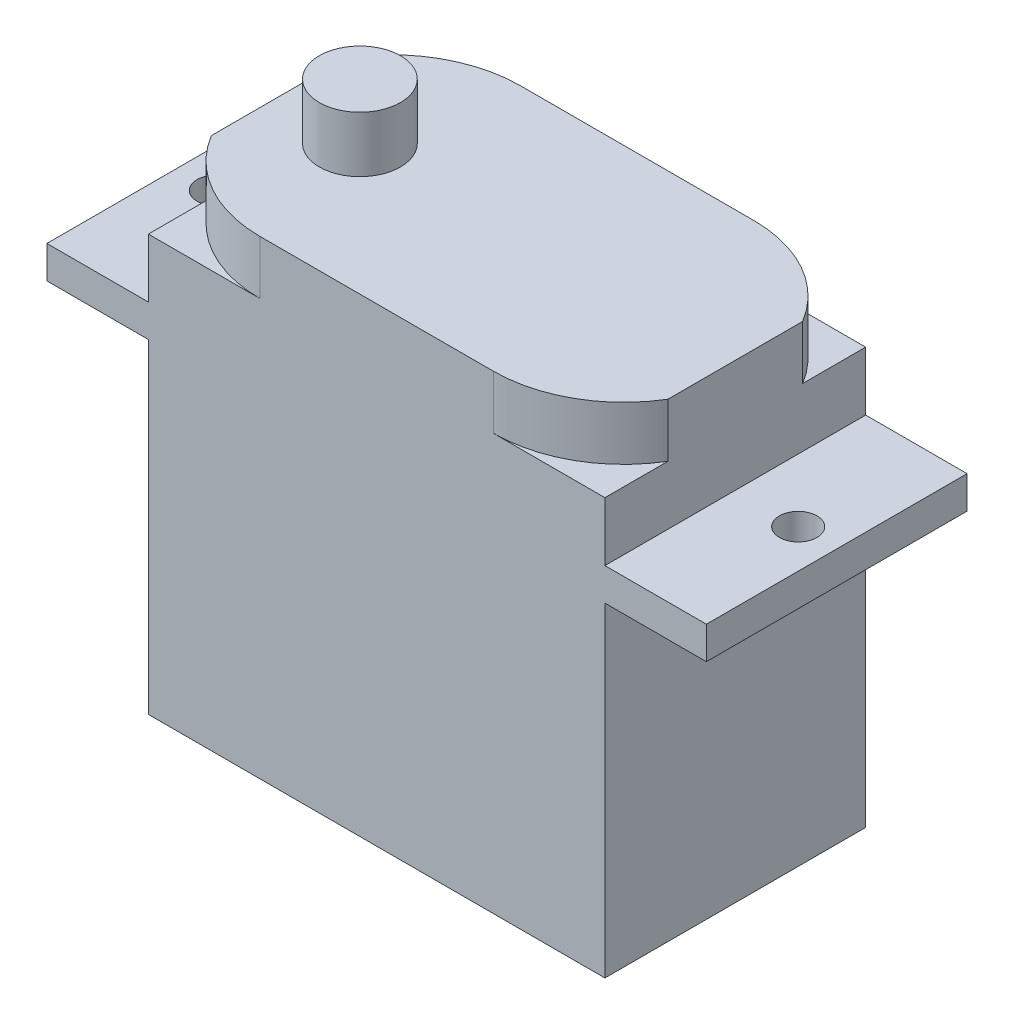
ISO-10303-21;
HEADER;
FILE_DESCRIPTION(('STEP AP214'),'2;1');
FILE_NAME('part.step','',(''),(''),'','','');
FILE_SCHEMA(('AUTOMOTIVE_DESIGN { 1 0 10303 214 1 1 1 1 }'));
ENDSEC;
DATA;
#1=APPLICATION_CONTEXT('core data for automotive mechanical design processes');
#2=APPLICATION_PROTOCOL_DEFINITION('international standard','automotive_design',2000,#1);
#3=PRODUCT_CONTEXT('',#1,'mechanical');
#4=PRODUCT('Part','Part','',(#3));
#5=PRODUCT_RELATED_PRODUCT_CATEGORY('part','',(#4));
#6=PRODUCT_DEFINITION_FORMATION('','',#4);
#7=PRODUCT_DEFINITION_CONTEXT('part definition',#1,'design');
#8=PRODUCT_DEFINITION('design','',#6,#7);
#9=PRODUCT_DEFINITION_SHAPE('','',#8);
#10=(LENGTH_UNIT() NAMED_UNIT(*) SI_UNIT(.MILLI.,.METRE.));
#11=(NAMED_UNIT(*) PLANE_ANGLE_UNIT() SI_UNIT($,.RADIAN.));
#12=(NAMED_UNIT(*) SI_UNIT($,.STERADIAN.) SOLID_ANGLE_UNIT());
#13=UNCERTAINTY_MEASURE_WITH_UNIT(LENGTH_MEASURE(1.E-05),#10,'distance_accuracy_value','');
#14=(GEOMETRIC_REPRESENTATION_CONTEXT(3) GLOBAL_UNCERTAINTY_ASSIGNED_CONTEXT((#13)) GLOBAL_UNIT_ASSIGNED_CONTEXT((#10,
#11,#12)) REPRESENTATION_CONTEXT('',''));
#15=CARTESIAN_POINT('',(0.,0.,0.));
#16=DIRECTION('',(0.,0.,1.));
#17=DIRECTION('',(1.,0.,0.));
#18=AXIS2_PLACEMENT_3D('',#15,#16,#17);
#19=CARTESIAN_POINT('',(-5.74999999999998,12.9,6.425));
#20=DIRECTION('',(0.,1.,0.));
#21=DIRECTION('',(0.,0.,1.));
#22=AXIS2_PLACEMENT_3D('',#19,#20,#21);
#23=PLANE('',#22);
#24=CARTESIAN_POINT('',(-5.74999999999998,12.9,6.425));
#25=DIRECTION('',(0.,1.,0.));
#26=DIRECTION('',(0.,0.,1.));
#27=AXIS2_PLACEMENT_3D('',#24,#25,#26);
#28=CIRCLE('',#27,6.425);
#29=CARTESIAN_POINT('',(-5.74999999999998,12.9,0.));
#30=VERTEX_POINT('',#29);
#31=CARTESIAN_POINT('',(-11.25,12.9,3.10376152617732));
#32=VERTEX_POINT('',#31);
#33=EDGE_CURVE('E321',#30,#32,#28,.T.);
#34=ORIENTED_EDGE('',*,*,#33,.T.);
#35=DIRECTION('',(0.,0.,1.));
#36=VECTOR('',#35,1.);
#37=CARTESIAN_POINT('',(-11.25,12.9,9.74623847382268));
#38=LINE('',#37,#36);
#39=CARTESIAN_POINT('',(-11.25,12.9,9.74623847382268));
#40=VERTEX_POINT('',#39);
#41=EDGE_CURVE('E651',#32,#40,#38,.T.);
#42=ORIENTED_EDGE('',*,*,#41,.T.);
#43=CARTESIAN_POINT('',(-5.74999999999998,12.9,6.425));
#44=DIRECTION('',(0.,1.,0.));
#45=DIRECTION('',(0.,0.,1.));
#46=AXIS2_PLACEMENT_3D('',#43,#44,#45);
#47=CIRCLE('',#46,6.425);
#48=CARTESIAN_POINT('',(-5.74999999999998,12.9,12.85));
#49=VERTEX_POINT('',#48);
#50=EDGE_CURVE('E653',#40,#49,#47,.T.);
#51=ORIENTED_EDGE('',*,*,#50,.T.);
#52=DIRECTION('',(1.,0.,0.));
#53=VECTOR('',#52,1.);
#54=CARTESIAN_POINT('',(-5.74999999999998,12.9,12.85));
#55=LINE('',#54,#53);
#56=CARTESIAN_POINT('',(5.75000000000004,12.9,12.85));
#57=VERTEX_POINT('',#56);
#58=EDGE_CURVE('E655',#49,#57,#55,.T.);
#59=ORIENTED_EDGE('',*,*,#58,.T.);
#60=CARTESIAN_POINT('',(5.75000000000004,12.9,6.425));
#61=DIRECTION('',(0.,1.,0.));
#62=DIRECTION('',(0.,0.,-1.));
#63=AXIS2_PLACEMENT_3D('',#60,#61,#62);
#64=CIRCLE('',#63,6.425);
#65=CARTESIAN_POINT('',(11.25,12.9,9.74623847382268));
#66=VERTEX_POINT('',#65);
#67=EDGE_CURVE('E657',#57,#66,#64,.T.);
#68=ORIENTED_EDGE('',*,*,#67,.T.);
#69=DIRECTION('',(0.,0.,-1.));
#70=VECTOR('',#69,1.);
#71=CARTESIAN_POINT('',(11.25,12.9,3.10376152617732));
#72=LINE('',#71,#70);
#73=CARTESIAN_POINT('',(11.25,12.9,3.10376152617732));
#74=VERTEX_POINT('',#73);
#75=EDGE_CURVE('E340',#66,#74,#72,.T.);
#76=ORIENTED_EDGE('',*,*,#75,.T.);
#77=CARTESIAN_POINT('',(5.75000000000004,12.9,6.425));
#78=DIRECTION('',(0.,1.,0.));
#79=DIRECTION('',(0.,0.,-1.));
#80=AXIS2_PLACEMENT_3D('',#77,#78,#79);
#81=CIRCLE('',#80,6.425);
#82=CARTESIAN_POINT('',(5.75000000000004,12.9,0.));
#83=VERTEX_POINT('',#82);
#84=EDGE_CURVE('E335',#74,#83,#81,.T.);
#85=ORIENTED_EDGE('',*,*,#84,.T.);
#86=DIRECTION('',(-1.,0.,0.));
#87=VECTOR('',#86,1.);
#88=CARTESIAN_POINT('',(-5.74999999999998,12.9,0.));
#89=LINE('',#88,#87);
#90=EDGE_CURVE('E661',#83,#30,#89,.T.);
#91=ORIENTED_EDGE('',*,*,#90,.T.);
#92=EDGE_LOOP('',(#34,#42,#51,#59,#68,#76,#85,#91));
#93=FACE_BOUND('',#92,.T.);
#94=CARTESIAN_POINT('',(-7.24999999999998,12.9,6.425));
#95=DIRECTION('',(0.,1.,0.));
#96=DIRECTION('',(0.,0.,1.));
#97=AXIS2_PLACEMENT_3D('',#94,#95,#96);
#98=CIRCLE('',#97,2.);
#99=CARTESIAN_POINT('',(-7.24999999999998,12.9,8.425));
#100=VERTEX_POINT('',#99);
#101=EDGE_CURVE('E722',#100,#100,#98,.T.);
#102=ORIENTED_EDGE('',*,*,#101,.F.);
#103=EDGE_LOOP('',(#102));
#104=FACE_BOUND('',#103,.T.);
#105=ADVANCED_FACE('F30',(#93,#104),#23,.T.);
#106=CARTESIAN_POINT('',(16.25,7.34999999999998,0.));
#107=DIRECTION('',(0.,1.,0.));
#108=DIRECTION('',(0.,0.,1.));
#109=AXIS2_PLACEMENT_3D('',#106,#107,#108);
#110=PLANE('',#109);
#111=DIRECTION('',(0.,0.,-1.));
#112=VECTOR('',#111,1.);
#113=CARTESIAN_POINT('',(11.25,7.34999999999998,0.));
#114=LINE('',#113,#112);
#115=CARTESIAN_POINT('',(11.25,7.34999999999998,12.85));
#116=VERTEX_POINT('',#115);
#117=CARTESIAN_POINT('',(11.25,7.34999999999998,0.));
#118=VERTEX_POINT('',#117);
#119=EDGE_CURVE('E204',#116,#118,#114,.T.);
#120=ORIENTED_EDGE('',*,*,#119,.F.);
#121=DIRECTION('',(-1.,0.,0.));
#122=VECTOR('',#121,1.);
#123=CARTESIAN_POINT('',(16.25,7.34999999999998,12.85));
#124=LINE('',#123,#122);
#125=CARTESIAN_POINT('',(16.25,7.34999999999998,12.85));
#126=VERTEX_POINT('',#125);
#127=EDGE_CURVE('E178',#126,#116,#124,.T.);
#128=ORIENTED_EDGE('',*,*,#127,.F.);
#129=DIRECTION('',(0.,0.,-1.));
#130=VECTOR('',#129,1.);
#131=CARTESIAN_POINT('',(16.25,7.34999999999998,0.));
#132=LINE('',#131,#130);
#133=CARTESIAN_POINT('',(16.25,7.34999999999998,0.));
#134=VERTEX_POINT('',#133);
#135=EDGE_CURVE('E184',#126,#134,#132,.T.);
#136=ORIENTED_EDGE('',*,*,#135,.T.);
#137=DIRECTION('',(-1.,0.,0.));
#138=VECTOR('',#137,1.);
#139=CARTESIAN_POINT('',(16.25,7.34999999999998,0.));
#140=LINE('',#139,#138);
#141=EDGE_CURVE('E47',#134,#118,#140,.T.);
#142=ORIENTED_EDGE('',*,*,#141,.T.);
#143=EDGE_LOOP('',(#120,#128,#136,#142));
#144=FACE_BOUND('',#143,.T.);
#145=CARTESIAN_POINT('',(14.35,7.34999999999998,6.425));
#146=DIRECTION('',(0.,-1.,0.));
#147=DIRECTION('',(0.,0.,1.));
#148=AXIS2_PLACEMENT_3D('',#145,#146,#147);
#149=CIRCLE('',#148,0.925000000000001);
#150=CARTESIAN_POINT('',(14.35,7.34999999999998,7.35));
#151=VERTEX_POINT('',#150);
#152=EDGE_CURVE('E721',#151,#151,#149,.T.);
#153=ORIENTED_EDGE('',*,*,#152,.T.);
#154=EDGE_LOOP('',(#153));
#155=FACE_BOUND('',#154,.T.);
#156=ADVANCED_FACE('F190',(#144,#155),#110,.T.);
#157=CARTESIAN_POINT('',(16.25,5.74999999999998,0.));
#158=DIRECTION('',(0.,-1.,0.));
#159=DIRECTION('',(0.,0.,-1.));
#160=AXIS2_PLACEMENT_3D('',#157,#158,#159);
#161=PLANE('',#160);
#162=DIRECTION('',(0.,0.,1.));
#163=VECTOR('',#162,1.);
#164=CARTESIAN_POINT('',(11.25,5.74999999999998,0.));
#165=LINE('',#164,#163);
#166=CARTESIAN_POINT('',(11.25,5.74999999999998,0.));
#167=VERTEX_POINT('',#166);
#168=CARTESIAN_POINT('',(11.25,5.74999999999998,12.85));
#169=VERTEX_POINT('',#168);
#170=EDGE_CURVE('E188',#167,#169,#165,.T.);
#171=ORIENTED_EDGE('',*,*,#170,.F.);
#172=DIRECTION('',(-1.,0.,0.));
#173=VECTOR('',#172,1.);
#174=CARTESIAN_POINT('',(16.25,5.74999999999998,0.));
#175=LINE('',#174,#173);
#176=CARTESIAN_POINT('',(16.25,5.74999999999998,0.));
#177=VERTEX_POINT('',#176);
#178=EDGE_CURVE('E198',#177,#167,#175,.T.);
#179=ORIENTED_EDGE('',*,*,#178,.F.);
#180=DIRECTION('',(0.,0.,1.));
#181=VECTOR('',#180,1.);
#182=CARTESIAN_POINT('',(16.25,5.74999999999998,0.));
#183=LINE('',#182,#181);
#184=CARTESIAN_POINT('',(16.25,5.74999999999998,12.85));
#185=VERTEX_POINT('',#184);
#186=EDGE_CURVE('E187',#177,#185,#183,.T.);
#187=ORIENTED_EDGE('',*,*,#186,.T.);
#188=DIRECTION('',(-1.,0.,0.));
#189=VECTOR('',#188,1.);
#190=CARTESIAN_POINT('',(16.25,5.74999999999998,12.85));
#191=LINE('',#190,#189);
#192=EDGE_CURVE('E213',#185,#169,#191,.T.);
#193=ORIENTED_EDGE('',*,*,#192,.T.);
#194=EDGE_LOOP('',(#171,#179,#187,#193));
#195=FACE_BOUND('',#194,.T.);
#196=CARTESIAN_POINT('',(14.35,5.74999999999998,6.425));
#197=DIRECTION('',(0.,-1.,0.));
#198=DIRECTION('',(0.,0.,-1.));
#199=AXIS2_PLACEMENT_3D('',#196,#197,#198);
#200=CIRCLE('',#199,0.925000000000001);
#201=CARTESIAN_POINT('',(14.35,5.74999999999998,5.5));
#202=VERTEX_POINT('',#201);
#203=EDGE_CURVE('E34',#202,#202,#200,.F.);
#204=ORIENTED_EDGE('',*,*,#203,.T.);
#205=EDGE_LOOP('',(#204));
#206=FACE_BOUND('',#205,.T.);
#207=ADVANCED_FACE('F227',(#195,#206),#161,.T.);
#208=CARTESIAN_POINT('',(11.25,-10.25,12.85));
#209=DIRECTION('',(-1.,0.,0.));
#210=DIRECTION('',(0.,0.,1.));
#211=AXIS2_PLACEMENT_3D('',#208,#209,#210);
#212=PLANE('',#211);
#213=DIRECTION('',(0.,1.,0.));
#214=VECTOR('',#213,1.);
#215=CARTESIAN_POINT('',(11.25,-10.25,0.));
#216=LINE('',#215,#214);
#217=CARTESIAN_POINT('',(11.25,-10.25,0.));
#218=VERTEX_POINT('',#217);
#219=EDGE_CURVE('E225',#218,#167,#216,.T.);
#220=ORIENTED_EDGE('',*,*,#219,.T.);
#221=ORIENTED_EDGE('',*,*,#170,.T.);
#222=DIRECTION('',(0.,1.,0.));
#223=VECTOR('',#222,1.);
#224=CARTESIAN_POINT('',(11.25,-10.25,12.85));
#225=LINE('',#224,#223);
#226=CARTESIAN_POINT('',(11.25,-10.25,12.85));
#227=VERTEX_POINT('',#226);
#228=EDGE_CURVE('E274',#227,#169,#225,.T.);
#229=ORIENTED_EDGE('',*,*,#228,.F.);
#230=DIRECTION('',(0.,0.,-1.));
#231=VECTOR('',#230,1.);
#232=CARTESIAN_POINT('',(11.25,-10.25,12.85));
#233=LINE('',#232,#231);
#234=EDGE_CURVE('E235',#227,#218,#233,.T.);
#235=ORIENTED_EDGE('',*,*,#234,.T.);
#236=EDGE_LOOP('',(#220,#221,#229,#235));
#237=FACE_BOUND('',#236,.T.);
#238=ADVANCED_FACE('F233',(#237),#212,.F.);
#239=CARTESIAN_POINT('',(-11.25,-10.25,12.85));
#240=DIRECTION('',(1.,0.,0.));
#241=DIRECTION('',(0.,0.,-1.));
#242=AXIS2_PLACEMENT_3D('',#239,#240,#241);
#243=PLANE('',#242);
#244=DIRECTION('',(0.,0.,-1.));
#245=VECTOR('',#244,1.);
#246=CARTESIAN_POINT('',(-11.25,7.34999999999998,0.));
#247=LINE('',#246,#245);
#248=CARTESIAN_POINT('',(-11.25,7.34999999999998,12.85));
#249=VERTEX_POINT('',#248);
#250=CARTESIAN_POINT('',(-11.25,7.34999999999998,0.));
#251=VERTEX_POINT('',#250);
#252=EDGE_CURVE('E55',#249,#251,#247,.T.);
#253=ORIENTED_EDGE('',*,*,#252,.F.);
#254=DIRECTION('',(0.,-1.,0.));
#255=VECTOR('',#254,1.);
#256=CARTESIAN_POINT('',(-11.25,-10.25,12.85));
#257=LINE('',#256,#255);
#258=CARTESIAN_POINT('',(-11.25,10.25,12.85));
#259=VERTEX_POINT('',#258);
#260=EDGE_CURVE('E286',#259,#249,#257,.T.);
#261=ORIENTED_EDGE('',*,*,#260,.F.);
#262=DIRECTION('',(0.,0.,-1.));
#263=VECTOR('',#262,1.);
#264=CARTESIAN_POINT('',(-11.25,10.25,12.85));
#265=LINE('',#264,#263);
#266=CARTESIAN_POINT('',(-11.25,10.25,9.74623847382268));
#267=VERTEX_POINT('',#266);
#268=EDGE_CURVE('E343',#259,#267,#265,.T.);
#269=ORIENTED_EDGE('',*,*,#268,.T.);
#270=DIRECTION('',(0.,-1.,0.));
#271=VECTOR('',#270,1.);
#272=CARTESIAN_POINT('',(-11.25,12.9,9.74623847382268));
#273=LINE('',#272,#271);
#274=EDGE_CURVE('E674',#40,#267,#273,.T.);
#275=ORIENTED_EDGE('',*,*,#274,.F.);
#276=ORIENTED_EDGE('',*,*,#41,.F.);
#277=DIRECTION('',(0.,-1.,0.));
#278=VECTOR('',#277,1.);
#279=CARTESIAN_POINT('',(-11.25,12.9,3.10376152617732));
#280=LINE('',#279,#278);
#281=CARTESIAN_POINT('',(-11.25,10.25,3.10376152617732));
#282=VERTEX_POINT('',#281);
#283=EDGE_CURVE('E241',#32,#282,#280,.T.);
#284=ORIENTED_EDGE('',*,*,#283,.T.);
#285=CARTESIAN_POINT('',(-11.25,10.25,0.));
#286=VERTEX_POINT('',#285);
#287=EDGE_CURVE('E345',#282,#286,#265,.T.);
#288=ORIENTED_EDGE('',*,*,#287,.T.);
#289=DIRECTION('',(0.,-1.,0.));
#290=VECTOR('',#289,1.);
#291=CARTESIAN_POINT('',(-11.25,-10.25,0.));
#292=LINE('',#291,#290);
#293=EDGE_CURVE('E289',#286,#251,#292,.T.);
#294=ORIENTED_EDGE('',*,*,#293,.T.);
#295=EDGE_LOOP('',(#253,#261,#269,#275,#276,#284,#288,#294));
#296=FACE_BOUND('',#295,.T.);
#297=ADVANCED_FACE('F529',(#296),#243,.F.);
#298=DIRECTION('',(0.,0.,1.));
#299=VECTOR('',#298,1.);
#300=CARTESIAN_POINT('',(-11.25,5.74999999999998,0.));
#301=LINE('',#300,#299);
#302=CARTESIAN_POINT('',(-11.25,5.74999999999998,0.));
#303=VERTEX_POINT('',#302);
#304=CARTESIAN_POINT('',(-11.25,5.74999999999998,12.85));
#305=VERTEX_POINT('',#304);
#306=EDGE_CURVE('E617',#303,#305,#301,.T.);
#307=ORIENTED_EDGE('',*,*,#306,.F.);
#308=CARTESIAN_POINT('',(-11.25,-10.25,0.));
#309=VERTEX_POINT('',#308);
#310=EDGE_CURVE('E261',#303,#309,#292,.T.);
#311=ORIENTED_EDGE('',*,*,#310,.T.);
#312=DIRECTION('',(0.,0.,-1.));
#313=VECTOR('',#312,1.);
#314=CARTESIAN_POINT('',(-11.25,-10.25,12.85));
#315=LINE('',#314,#313);
#316=CARTESIAN_POINT('',(-11.25,-10.25,12.85));
#317=VERTEX_POINT('',#316);
#318=EDGE_CURVE('E349',#317,#309,#315,.T.);
#319=ORIENTED_EDGE('',*,*,#318,.F.);
#320=EDGE_CURVE('E283',#305,#317,#257,.T.);
#321=ORIENTED_EDGE('',*,*,#320,.F.);
#322=EDGE_LOOP('',(#307,#311,#319,#321));
#323=FACE_BOUND('',#322,.T.);
#324=ADVANCED_FACE('F565',(#323),#243,.F.);
#325=CARTESIAN_POINT('',(-11.25,10.25,12.85));
#326=DIRECTION('',(0.,-1.,0.));
#327=DIRECTION('',(0.,0.,-1.));
#328=AXIS2_PLACEMENT_3D('',#325,#326,#327);
#329=PLANE('',#328);
#330=CARTESIAN_POINT('',(-5.74999999999998,10.25,6.425));
#331=DIRECTION('',(0.,1.,0.));
#332=DIRECTION('',(0.,0.,1.));
#333=AXIS2_PLACEMENT_3D('',#330,#331,#332);
#334=CIRCLE('',#333,6.425);
#335=CARTESIAN_POINT('',(-5.74999999999998,10.25,0.));
#336=VERTEX_POINT('',#335);
#337=EDGE_CURVE('E628',#336,#282,#334,.T.);
#338=ORIENTED_EDGE('',*,*,#337,.F.);
#339=DIRECTION('',(-1.,0.,0.));
#340=VECTOR('',#339,1.);
#341=CARTESIAN_POINT('',(-11.25,10.25,0.));
#342=LINE('',#341,#340);
#343=EDGE_CURVE('E236',#336,#286,#342,.T.);
#344=ORIENTED_EDGE('',*,*,#343,.T.);
#345=ORIENTED_EDGE('',*,*,#287,.F.);
#346=EDGE_LOOP('',(#338,#344,#345));
#347=FACE_BOUND('',#346,.T.);
#348=ADVANCED_FACE('F547',(#347),#329,.F.);
#349=CARTESIAN_POINT('',(5.75000000000004,10.25,6.425));
#350=DIRECTION('',(0.,1.,0.));
#351=DIRECTION('',(0.,0.,-1.));
#352=AXIS2_PLACEMENT_3D('',#349,#350,#351);
#353=CIRCLE('',#352,6.425);
#354=CARTESIAN_POINT('',(11.25,10.25,3.10376152617732));
#355=VERTEX_POINT('',#354);
#356=CARTESIAN_POINT('',(5.75000000000004,10.25,0.));
#357=VERTEX_POINT('',#356);
#358=EDGE_CURVE('E308',#355,#357,#353,.T.);
#359=ORIENTED_EDGE('',*,*,#358,.F.);
#360=DIRECTION('',(0.,0.,-1.));
#361=VECTOR('',#360,1.);
#362=CARTESIAN_POINT('',(11.25,10.25,12.85));
#363=LINE('',#362,#361);
#364=CARTESIAN_POINT('',(11.25,10.25,0.));
#365=VERTEX_POINT('',#364);
#366=EDGE_CURVE('E39',#355,#365,#363,.T.);
#367=ORIENTED_EDGE('',*,*,#366,.T.);
#368=EDGE_CURVE('E239',#365,#357,#342,.T.);
#369=ORIENTED_EDGE('',*,*,#368,.T.);
#370=EDGE_LOOP('',(#359,#367,#369));
#371=FACE_BOUND('',#370,.T.);
#372=ADVANCED_FACE('F553',(#371),#329,.F.);
#373=CARTESIAN_POINT('',(5.75000000000004,10.25,6.425));
#374=DIRECTION('',(0.,1.,0.));
#375=DIRECTION('',(0.,0.,-1.));
#376=AXIS2_PLACEMENT_3D('',#373,#374,#375);
#377=CIRCLE('',#376,6.425);
#378=CARTESIAN_POINT('',(5.75000000000004,10.25,12.85));
#379=VERTEX_POINT('',#378);
#380=CARTESIAN_POINT('',(11.25,10.25,9.74623847382268));
#381=VERTEX_POINT('',#380);
#382=EDGE_CURVE('E304',#379,#381,#377,.T.);
#383=ORIENTED_EDGE('',*,*,#382,.F.);
#384=DIRECTION('',(-1.,0.,0.));
#385=VECTOR('',#384,1.);
#386=CARTESIAN_POINT('',(-11.25,10.25,12.85));
#387=LINE('',#386,#385);
#388=CARTESIAN_POINT('',(11.25,10.25,12.85));
#389=VERTEX_POINT('',#388);
#390=EDGE_CURVE('E273',#389,#379,#387,.T.);
#391=ORIENTED_EDGE('',*,*,#390,.F.);
#392=EDGE_CURVE('E11',#389,#381,#363,.T.);
#393=ORIENTED_EDGE('',*,*,#392,.T.);
#394=EDGE_LOOP('',(#383,#391,#393));
#395=FACE_BOUND('',#394,.T.);
#396=ADVANCED_FACE('F545',(#395),#329,.F.);
#397=CARTESIAN_POINT('',(-5.74999999999998,10.25,6.425));
#398=DIRECTION('',(0.,1.,0.));
#399=DIRECTION('',(0.,0.,1.));
#400=AXIS2_PLACEMENT_3D('',#397,#398,#399);
#401=CIRCLE('',#400,6.425);
#402=CARTESIAN_POINT('',(-5.74999999999998,10.25,12.85));
#403=VERTEX_POINT('',#402);
#404=EDGE_CURVE('E309',#267,#403,#401,.T.);
#405=ORIENTED_EDGE('',*,*,#404,.F.);
#406=ORIENTED_EDGE('',*,*,#268,.F.);
#407=EDGE_CURVE('E270',#403,#259,#387,.T.);
#408=ORIENTED_EDGE('',*,*,#407,.F.);
#409=EDGE_LOOP('',(#405,#406,#408));
#410=FACE_BOUND('',#409,.T.);
#411=ADVANCED_FACE('F369',(#410),#329,.F.);
#412=EDGE_CURVE('E206',#116,#389,#225,.T.);
#413=ORIENTED_EDGE('',*,*,#412,.F.);
#414=ORIENTED_EDGE('',*,*,#119,.T.);
#415=EDGE_CURVE('E176',#118,#365,#216,.T.);
#416=ORIENTED_EDGE('',*,*,#415,.T.);
#417=ORIENTED_EDGE('',*,*,#366,.F.);
#418=DIRECTION('',(0.,-1.,0.));
#419=VECTOR('',#418,1.);
#420=CARTESIAN_POINT('',(11.25,12.9,3.10376152617732));
#421=LINE('',#420,#419);
#422=EDGE_CURVE('E303',#74,#355,#421,.T.);
#423=ORIENTED_EDGE('',*,*,#422,.F.);
#424=ORIENTED_EDGE('',*,*,#75,.F.);
#425=DIRECTION('',(0.,-1.,0.));
#426=VECTOR('',#425,1.);
#427=CARTESIAN_POINT('',(11.25,12.9,9.74623847382268));
#428=LINE('',#427,#426);
#429=EDGE_CURVE('E298',#66,#381,#428,.T.);
#430=ORIENTED_EDGE('',*,*,#429,.T.);
#431=ORIENTED_EDGE('',*,*,#392,.F.);
#432=EDGE_LOOP('',(#413,#414,#416,#417,#423,#424,#430,#431));
#433=FACE_BOUND('',#432,.T.);
#434=ADVANCED_FACE('F32',(#433),#212,.F.);
#435=CARTESIAN_POINT('',(-11.25,-10.25,12.85));
#436=DIRECTION('',(0.,1.,0.));
#437=DIRECTION('',(0.,0.,1.));
#438=AXIS2_PLACEMENT_3D('',#435,#436,#437);
#439=PLANE('',#438);
#440=DIRECTION('',(1.,0.,0.));
#441=VECTOR('',#440,1.);
#442=CARTESIAN_POINT('',(-11.25,-10.25,0.));
#443=LINE('',#442,#441);
#444=EDGE_CURVE('E291',#309,#218,#443,.T.);
#445=ORIENTED_EDGE('',*,*,#444,.T.);
#446=ORIENTED_EDGE('',*,*,#234,.F.);
#447=DIRECTION('',(1.,0.,0.));
#448=VECTOR('',#447,1.);
#449=CARTESIAN_POINT('',(-11.25,-10.25,12.85));
#450=LINE('',#449,#448);
#451=EDGE_CURVE('E250',#317,#227,#450,.T.);
#452=ORIENTED_EDGE('',*,*,#451,.F.);
#453=ORIENTED_EDGE('',*,*,#318,.T.);
#454=EDGE_LOOP('',(#445,#446,#452,#453));
#455=FACE_BOUND('',#454,.T.);
#456=ADVANCED_FACE('F361',(#455),#439,.F.);
#457=CARTESIAN_POINT('',(11.25,10.25,12.85));
#458=DIRECTION('',(0.,0.,-1.));
#459=DIRECTION('',(-1.,0.,0.));
#460=AXIS2_PLACEMENT_3D('',#457,#458,#459);
#461=PLANE('',#460);
#462=ORIENTED_EDGE('',*,*,#228,.T.);
#463=ORIENTED_EDGE('',*,*,#192,.F.);
#464=DIRECTION('',(0.,1.,0.));
#465=VECTOR('',#464,1.);
#466=CARTESIAN_POINT('',(16.25,7.34999999999998,12.85));
#467=LINE('',#466,#465);
#468=EDGE_CURVE('E192',#185,#126,#467,.T.);
#469=ORIENTED_EDGE('',*,*,#468,.T.);
#470=ORIENTED_EDGE('',*,*,#127,.T.);
#471=ORIENTED_EDGE('',*,*,#412,.T.);
#472=ORIENTED_EDGE('',*,*,#390,.T.);
#473=DIRECTION('',(0.,-1.,0.));
#474=VECTOR('',#473,1.);
#475=CARTESIAN_POINT('',(5.75000000000004,12.9,12.85));
#476=LINE('',#475,#474);
#477=EDGE_CURVE('E294',#57,#379,#476,.T.);
#478=ORIENTED_EDGE('',*,*,#477,.F.);
#479=ORIENTED_EDGE('',*,*,#58,.F.);
#480=DIRECTION('',(0.,-1.,0.));
#481=VECTOR('',#480,1.);
#482=CARTESIAN_POINT('',(-5.74999999999998,12.9,12.85));
#483=LINE('',#482,#481);
#484=EDGE_CURVE('E297',#49,#403,#483,.T.);
#485=ORIENTED_EDGE('',*,*,#484,.T.);
#486=ORIENTED_EDGE('',*,*,#407,.T.);
#487=ORIENTED_EDGE('',*,*,#260,.T.);
#488=DIRECTION('',(1.,0.,0.));
#489=VECTOR('',#488,1.);
#490=CARTESIAN_POINT('',(-16.25,7.34999999999998,12.85));
#491=LINE('',#490,#489);
#492=CARTESIAN_POINT('',(-16.25,7.34999999999998,12.85));
#493=VERTEX_POINT('',#492);
#494=EDGE_CURVE('E633',#493,#249,#491,.T.);
#495=ORIENTED_EDGE('',*,*,#494,.F.);
#496=DIRECTION('',(0.,1.,0.));
#497=VECTOR('',#496,1.);
#498=CARTESIAN_POINT('',(-16.25,7.34999999999998,12.85));
#499=LINE('',#498,#497);
#500=CARTESIAN_POINT('',(-16.25,5.74999999999998,12.85));
#501=VERTEX_POINT('',#500);
#502=EDGE_CURVE('E698',#501,#493,#499,.T.);
#503=ORIENTED_EDGE('',*,*,#502,.F.);
#504=DIRECTION('',(1.,0.,0.));
#505=VECTOR('',#504,1.);
#506=CARTESIAN_POINT('',(-16.25,5.74999999999998,12.85));
#507=LINE('',#506,#505);
#508=EDGE_CURVE('E629',#501,#305,#507,.T.);
#509=ORIENTED_EDGE('',*,*,#508,.T.);
#510=ORIENTED_EDGE('',*,*,#320,.T.);
#511=ORIENTED_EDGE('',*,*,#451,.T.);
#512=EDGE_LOOP('',(#462,#463,#469,#470,#471,#472,#478,#479,#485,#486,#487,#495,#503,#509,#510,#511));
#513=FACE_BOUND('',#512,.T.);
#514=ADVANCED_FACE('F359',(#513),#461,.F.);
#515=CARTESIAN_POINT('',(11.25,10.25,0.));
#516=DIRECTION('',(0.,0.,-1.));
#517=DIRECTION('',(-1.,0.,0.));
#518=AXIS2_PLACEMENT_3D('',#515,#516,#517);
#519=PLANE('',#518);
#520=ORIENTED_EDGE('',*,*,#219,.F.);
#521=ORIENTED_EDGE('',*,*,#444,.F.);
#522=ORIENTED_EDGE('',*,*,#310,.F.);
#523=DIRECTION('',(1.,0.,0.));
#524=VECTOR('',#523,1.);
#525=CARTESIAN_POINT('',(-16.25,5.74999999999998,0.));
#526=LINE('',#525,#524);
#527=CARTESIAN_POINT('',(-16.25,5.74999999999998,0.));
#528=VERTEX_POINT('',#527);
#529=EDGE_CURVE('E625',#528,#303,#526,.T.);
#530=ORIENTED_EDGE('',*,*,#529,.F.);
#531=DIRECTION('',(0.,-1.,0.));
#532=VECTOR('',#531,1.);
#533=CARTESIAN_POINT('',(-16.25,7.34999999999998,0.));
#534=LINE('',#533,#532);
#535=CARTESIAN_POINT('',(-16.25,7.34999999999998,0.));
#536=VERTEX_POINT('',#535);
#537=EDGE_CURVE('E642',#536,#528,#534,.T.);
#538=ORIENTED_EDGE('',*,*,#537,.F.);
#539=DIRECTION('',(1.,0.,0.));
#540=VECTOR('',#539,1.);
#541=CARTESIAN_POINT('',(-16.25,7.34999999999998,0.));
#542=LINE('',#541,#540);
#543=EDGE_CURVE('E643',#536,#251,#542,.T.);
#544=ORIENTED_EDGE('',*,*,#543,.T.);
#545=ORIENTED_EDGE('',*,*,#293,.F.);
#546=ORIENTED_EDGE('',*,*,#343,.F.);
#547=DIRECTION('',(0.,-1.,0.));
#548=VECTOR('',#547,1.);
#549=CARTESIAN_POINT('',(-5.74999999999998,12.9,0.));
#550=LINE('',#549,#548);
#551=EDGE_CURVE('E327',#30,#336,#550,.T.);
#552=ORIENTED_EDGE('',*,*,#551,.F.);
#553=ORIENTED_EDGE('',*,*,#90,.F.);
#554=DIRECTION('',(0.,-1.,0.));
#555=VECTOR('',#554,1.);
#556=CARTESIAN_POINT('',(5.75000000000004,12.9,0.));
#557=LINE('',#556,#555);
#558=EDGE_CURVE('E324',#83,#357,#557,.T.);
#559=ORIENTED_EDGE('',*,*,#558,.T.);
#560=ORIENTED_EDGE('',*,*,#368,.F.);
#561=ORIENTED_EDGE('',*,*,#415,.F.);
#562=ORIENTED_EDGE('',*,*,#141,.F.);
#563=DIRECTION('',(0.,-1.,0.));
#564=VECTOR('',#563,1.);
#565=CARTESIAN_POINT('',(16.25,7.34999999999998,0.));
#566=LINE('',#565,#564);
#567=EDGE_CURVE('E173',#134,#177,#566,.T.);
#568=ORIENTED_EDGE('',*,*,#567,.T.);
#569=ORIENTED_EDGE('',*,*,#178,.T.);
#570=EDGE_LOOP('',(#520,#521,#522,#530,#538,#544,#545,#546,#552,#553,#559,#560,#561,#562,#568,#569));
#571=FACE_BOUND('',#570,.T.);
#572=ADVANCED_FACE('F172',(#571),#519,.T.);
#573=CARTESIAN_POINT('',(-5.74999999999998,12.9,6.425));
#574=DIRECTION('',(0.,-1.,0.));
#575=DIRECTION('',(0.,0.,-1.));
#576=AXIS2_PLACEMENT_3D('',#573,#574,#575);
#577=CYLINDRICAL_SURFACE('',#576,6.425);
#578=ORIENTED_EDGE('',*,*,#337,.T.);
#579=ORIENTED_EDGE('',*,*,#283,.F.);
#580=ORIENTED_EDGE('',*,*,#33,.F.);
#581=ORIENTED_EDGE('',*,*,#551,.T.);
#582=EDGE_LOOP('',(#578,#579,#580,#581));
#583=FACE_BOUND('',#582,.T.);
#584=ADVANCED_FACE('F394',(#583),#577,.T.);
#585=CARTESIAN_POINT('',(-5.74999999999998,12.9,6.425));
#586=DIRECTION('',(0.,-1.,0.));
#587=DIRECTION('',(0.,0.,-1.));
#588=AXIS2_PLACEMENT_3D('',#585,#586,#587);
#589=CYLINDRICAL_SURFACE('',#588,6.425);
#590=ORIENTED_EDGE('',*,*,#404,.T.);
#591=ORIENTED_EDGE('',*,*,#484,.F.);
#592=ORIENTED_EDGE('',*,*,#50,.F.);
#593=ORIENTED_EDGE('',*,*,#274,.T.);
#594=EDGE_LOOP('',(#590,#591,#592,#593));
#595=FACE_BOUND('',#594,.T.);
#596=ADVANCED_FACE('F390',(#595),#589,.T.);
#597=CARTESIAN_POINT('',(5.75000000000004,12.9,6.425));
#598=DIRECTION('',(0.,-1.,0.));
#599=DIRECTION('',(0.,0.,-1.));
#600=AXIS2_PLACEMENT_3D('',#597,#598,#599);
#601=CYLINDRICAL_SURFACE('',#600,6.425);
#602=ORIENTED_EDGE('',*,*,#382,.T.);
#603=ORIENTED_EDGE('',*,*,#429,.F.);
#604=ORIENTED_EDGE('',*,*,#67,.F.);
#605=ORIENTED_EDGE('',*,*,#477,.T.);
#606=EDGE_LOOP('',(#602,#603,#604,#605));
#607=FACE_BOUND('',#606,.T.);
#608=ADVANCED_FACE('F387',(#607),#601,.T.);
#609=CARTESIAN_POINT('',(5.75000000000004,12.9,6.425));
#610=DIRECTION('',(0.,-1.,0.));
#611=DIRECTION('',(0.,0.,-1.));
#612=AXIS2_PLACEMENT_3D('',#609,#610,#611);
#613=CYLINDRICAL_SURFACE('',#612,6.425);
#614=ORIENTED_EDGE('',*,*,#358,.T.);
#615=ORIENTED_EDGE('',*,*,#558,.F.);
#616=ORIENTED_EDGE('',*,*,#84,.F.);
#617=ORIENTED_EDGE('',*,*,#422,.T.);
#618=EDGE_LOOP('',(#614,#615,#616,#617));
#619=FACE_BOUND('',#618,.T.);
#620=ADVANCED_FACE('F333',(#619),#613,.T.);
#621=CARTESIAN_POINT('',(-16.25,5.74999999999998,0.));
#622=DIRECTION('',(0.,1.,0.));
#623=DIRECTION('',(0.,0.,1.));
#624=AXIS2_PLACEMENT_3D('',#621,#622,#623);
#625=PLANE('',#624);
#626=CARTESIAN_POINT('',(-14.35,5.74999999999998,6.425));
#627=DIRECTION('',(0.,1.,0.));
#628=DIRECTION('',(0.,0.,1.));
#629=AXIS2_PLACEMENT_3D('',#626,#627,#628);
#630=CIRCLE('',#629,0.925000000000001);
#631=CARTESIAN_POINT('',(-14.35,5.74999999999998,7.35));
#632=VERTEX_POINT('',#631);
#633=EDGE_CURVE('E622',#632,#632,#630,.T.);
#634=ORIENTED_EDGE('',*,*,#633,.T.);
#635=EDGE_LOOP('',(#634));
#636=FACE_BOUND('',#635,.T.);
#637=ORIENTED_EDGE('',*,*,#306,.T.);
#638=ORIENTED_EDGE('',*,*,#508,.F.);
#639=DIRECTION('',(0.,0.,1.));
#640=VECTOR('',#639,1.);
#641=CARTESIAN_POINT('',(-16.25,5.74999999999998,0.));
#642=LINE('',#641,#640);
#643=EDGE_CURVE('E626',#528,#501,#642,.T.);
#644=ORIENTED_EDGE('',*,*,#643,.F.);
#645=ORIENTED_EDGE('',*,*,#529,.T.);
#646=EDGE_LOOP('',(#637,#638,#644,#645));
#647=FACE_BOUND('',#646,.T.);
#648=ADVANCED_FACE('F383',(#636,#647),#625,.F.);
#649=CARTESIAN_POINT('',(-16.25,7.34999999999998,0.));
#650=DIRECTION('',(0.,-1.,0.));
#651=DIRECTION('',(0.,0.,-1.));
#652=AXIS2_PLACEMENT_3D('',#649,#650,#651);
#653=PLANE('',#652);
#654=CARTESIAN_POINT('',(-14.35,7.34999999999998,6.425));
#655=DIRECTION('',(0.,1.,0.));
#656=DIRECTION('',(0.,0.,1.));
#657=AXIS2_PLACEMENT_3D('',#654,#655,#656);
#658=CIRCLE('',#657,0.925000000000001);
#659=CARTESIAN_POINT('',(-14.35,7.34999999999998,7.35));
#660=VERTEX_POINT('',#659);
#661=EDGE_CURVE('E177',#660,#660,#658,.T.);
#662=ORIENTED_EDGE('',*,*,#661,.F.);
#663=EDGE_LOOP('',(#662));
#664=FACE_BOUND('',#663,.T.);
#665=ORIENTED_EDGE('',*,*,#252,.T.);
#666=ORIENTED_EDGE('',*,*,#543,.F.);
#667=DIRECTION('',(0.,0.,-1.));
#668=VECTOR('',#667,1.);
#669=CARTESIAN_POINT('',(-16.25,7.34999999999998,0.));
#670=LINE('',#669,#668);
#671=EDGE_CURVE('E696',#493,#536,#670,.T.);
#672=ORIENTED_EDGE('',*,*,#671,.F.);
#673=ORIENTED_EDGE('',*,*,#494,.T.);
#674=EDGE_LOOP('',(#665,#666,#672,#673));
#675=FACE_BOUND('',#674,.T.);
#676=ADVANCED_FACE('F428',(#664,#675),#653,.F.);
#677=CARTESIAN_POINT('',(-16.25,5.74999999999998,0.));
#678=DIRECTION('',(-1.,0.,0.));
#679=DIRECTION('',(0.,0.,1.));
#680=AXIS2_PLACEMENT_3D('',#677,#678,#679);
#681=PLANE('',#680);
#682=ORIENTED_EDGE('',*,*,#537,.T.);
#683=ORIENTED_EDGE('',*,*,#643,.T.);
#684=ORIENTED_EDGE('',*,*,#502,.T.);
#685=ORIENTED_EDGE('',*,*,#671,.T.);
#686=EDGE_LOOP('',(#682,#683,#684,#685));
#687=FACE_BOUND('',#686,.T.);
#688=ADVANCED_FACE('F436',(#687),#681,.T.);
#689=CARTESIAN_POINT('',(-14.35,4.59999999999998,6.425));
#690=DIRECTION('',(0.,1.,0.));
#691=DIRECTION('',(0.,0.,1.));
#692=AXIS2_PLACEMENT_3D('',#689,#690,#691);
#693=CYLINDRICAL_SURFACE('',#692,0.925000000000001);
#694=ORIENTED_EDGE('',*,*,#661,.T.);
#695=EDGE_LOOP('',(#694));
#696=FACE_BOUND('',#695,.T.);
#697=ORIENTED_EDGE('',*,*,#633,.F.);
#698=EDGE_LOOP('',(#697));
#699=FACE_BOUND('',#698,.T.);
#700=ADVANCED_FACE('F443',(#696,#699),#693,.F.);
#701=CARTESIAN_POINT('',(16.25,5.74999999999998,0.));
#702=DIRECTION('',(1.,0.,0.));
#703=DIRECTION('',(0.,0.,1.));
#704=AXIS2_PLACEMENT_3D('',#701,#702,#703);
#705=PLANE('',#704);
#706=ORIENTED_EDGE('',*,*,#567,.F.);
#707=ORIENTED_EDGE('',*,*,#135,.F.);
#708=ORIENTED_EDGE('',*,*,#468,.F.);
#709=ORIENTED_EDGE('',*,*,#186,.F.);
#710=EDGE_LOOP('',(#706,#707,#708,#709));
#711=FACE_BOUND('',#710,.T.);
#712=ADVANCED_FACE('F182',(#711),#705,.T.);
#713=CARTESIAN_POINT('',(14.35,4.59999999999998,6.425));
#714=DIRECTION('',(0.,1.,0.));
#715=DIRECTION('',(0.,0.,1.));
#716=AXIS2_PLACEMENT_3D('',#713,#714,#715);
#717=CYLINDRICAL_SURFACE('',#716,0.925000000000001);
#718=ORIENTED_EDGE('',*,*,#203,.F.);
#719=EDGE_LOOP('',(#718));
#720=FACE_BOUND('',#719,.T.);
#721=ORIENTED_EDGE('',*,*,#152,.F.);
#722=EDGE_LOOP('',(#721));
#723=FACE_BOUND('',#722,.T.);
#724=ADVANCED_FACE('F458',(#720,#723),#717,.F.);
#725=CARTESIAN_POINT('',(-7.24999999999998,15.65,6.425));
#726=DIRECTION('',(0.,-1.,0.));
#727=DIRECTION('',(0.,0.,-1.));
#728=AXIS2_PLACEMENT_3D('',#725,#726,#727);
#729=CYLINDRICAL_SURFACE('',#728,2.);
#730=CARTESIAN_POINT('',(-7.24999999999998,15.65,6.425));
#731=DIRECTION('',(0.,1.,0.));
#732=DIRECTION('',(0.,0.,1.));
#733=AXIS2_PLACEMENT_3D('',#730,#731,#732);
#734=CIRCLE('',#733,2.);
#735=CARTESIAN_POINT('',(-7.24999999999998,15.65,8.425));
#736=VERTEX_POINT('',#735);
#737=EDGE_CURVE('E720',#736,#736,#734,.T.);
#738=ORIENTED_EDGE('',*,*,#737,.F.);
#739=EDGE_LOOP('',(#738));
#740=FACE_BOUND('',#739,.T.);
#741=ORIENTED_EDGE('',*,*,#101,.T.);
#742=EDGE_LOOP('',(#741));
#743=FACE_BOUND('',#742,.T.);
#744=ADVANCED_FACE('F465',(#740,#743),#729,.T.);
#745=CARTESIAN_POINT('',(-7.24999999999998,15.65,6.425));
#746=DIRECTION('',(0.,1.,0.));
#747=DIRECTION('',(0.,0.,1.));
#748=AXIS2_PLACEMENT_3D('',#745,#746,#747);
#749=PLANE('',#748);
#750=ORIENTED_EDGE('',*,*,#737,.T.);
#751=EDGE_LOOP('',(#750));
#752=FACE_BOUND('',#751,.T.);
#753=ADVANCED_FACE('F473',(#752),#749,.T.);
#754=CLOSED_SHELL('',(#105,#156,#207,#238,#297,#324,#348,#372,#396,#411,#434,#456,#514,#572,
#584,#596,#608,#620,#648,#676,#688,#700,#712,#724,#744,#753));
#755=MANIFOLD_SOLID_BREP('B2',#754);
#756=ADVANCED_BREP_SHAPE_REPRESENTATION('',(#18,#755),#14);
#757=SHAPE_DEFINITION_REPRESENTATION(#9,#756);
ENDSEC;
END-ISO-10303-21;
